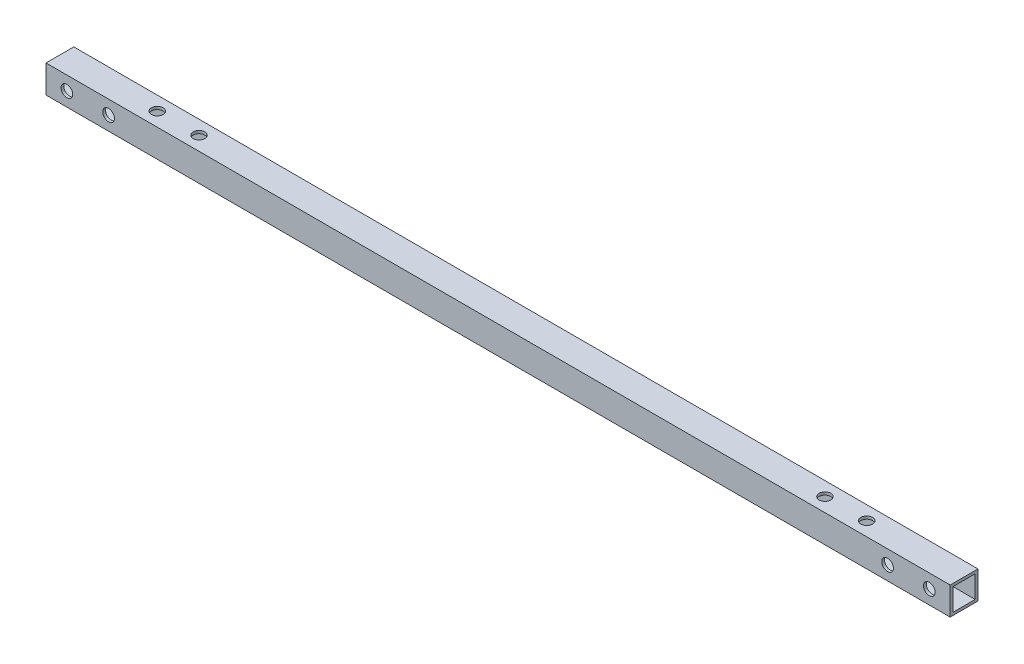
ISO-10303-21;
HEADER;
FILE_DESCRIPTION(('STEP AP214'),'2;1');
FILE_NAME('part.step','',(''),(''),'','','');
FILE_SCHEMA(('AUTOMOTIVE_DESIGN { 1 0 10303 214 1 1 1 1 }'));
ENDSEC;
DATA;
#1=APPLICATION_CONTEXT('core data for automotive mechanical design processes');
#2=APPLICATION_PROTOCOL_DEFINITION('international standard','automotive_design',2000,#1);
#3=PRODUCT_CONTEXT('',#1,'mechanical');
#4=PRODUCT('Part','Part','',(#3));
#5=PRODUCT_RELATED_PRODUCT_CATEGORY('part','',(#4));
#6=PRODUCT_DEFINITION_FORMATION('','',#4);
#7=PRODUCT_DEFINITION_CONTEXT('part definition',#1,'design');
#8=PRODUCT_DEFINITION('design','',#6,#7);
#9=PRODUCT_DEFINITION_SHAPE('','',#8);
#10=(LENGTH_UNIT() NAMED_UNIT(*) SI_UNIT(.MILLI.,.METRE.));
#11=(NAMED_UNIT(*) PLANE_ANGLE_UNIT() SI_UNIT($,.RADIAN.));
#12=(NAMED_UNIT(*) SI_UNIT($,.STERADIAN.) SOLID_ANGLE_UNIT());
#13=UNCERTAINTY_MEASURE_WITH_UNIT(LENGTH_MEASURE(1.E-05),#10,'distance_accuracy_value','');
#14=(GEOMETRIC_REPRESENTATION_CONTEXT(3) GLOBAL_UNCERTAINTY_ASSIGNED_CONTEXT((#13)) GLOBAL_UNIT_ASSIGNED_CONTEXT((#10,
#11,#12)) REPRESENTATION_CONTEXT('',''));
#15=CARTESIAN_POINT('',(0.,0.,0.));
#16=DIRECTION('',(0.,0.,1.));
#17=DIRECTION('',(1.,0.,0.));
#18=AXIS2_PLACEMENT_3D('',#15,#16,#17);
#19=CARTESIAN_POINT('',(325.,0.,0.));
#20=DIRECTION('',(1.,0.,0.));
#21=DIRECTION('',(0.,0.,-1.));
#22=AXIS2_PLACEMENT_3D('',#19,#20,#21);
#23=PLANE('',#22);
#24=DIRECTION('',(0.,1.,0.));
#25=VECTOR('',#24,1.);
#26=CARTESIAN_POINT('',(325.,5.,-5.));
#27=LINE('',#26,#25);
#28=CARTESIAN_POINT('',(325.,-5.,-5.));
#29=VERTEX_POINT('',#28);
#30=CARTESIAN_POINT('',(325.,5.,-5.));
#31=VERTEX_POINT('',#30);
#32=EDGE_CURVE('E164',#29,#31,#27,.T.);
#33=ORIENTED_EDGE('',*,*,#32,.T.);
#34=DIRECTION('',(0.,0.,1.));
#35=VECTOR('',#34,1.);
#36=CARTESIAN_POINT('',(325.,5.,5.));
#37=LINE('',#36,#35);
#38=CARTESIAN_POINT('',(325.,5.,5.));
#39=VERTEX_POINT('',#38);
#40=EDGE_CURVE('E167',#31,#39,#37,.T.);
#41=ORIENTED_EDGE('',*,*,#40,.T.);
#42=DIRECTION('',(0.,-1.,0.));
#43=VECTOR('',#42,1.);
#44=CARTESIAN_POINT('',(325.,5.,5.));
#45=LINE('',#44,#43);
#46=CARTESIAN_POINT('',(325.,-5.,5.));
#47=VERTEX_POINT('',#46);
#48=EDGE_CURVE('E170',#39,#47,#45,.T.);
#49=ORIENTED_EDGE('',*,*,#48,.T.);
#50=DIRECTION('',(0.,0.,-1.));
#51=VECTOR('',#50,1.);
#52=CARTESIAN_POINT('',(325.,-5.,5.));
#53=LINE('',#52,#51);
#54=EDGE_CURVE('E172',#47,#29,#53,.T.);
#55=ORIENTED_EDGE('',*,*,#54,.T.);
#56=EDGE_LOOP('',(#33,#41,#49,#55));
#57=FACE_BOUND('',#56,.T.);
#58=DIRECTION('',(0.,0.,1.));
#59=VECTOR('',#58,1.);
#60=CARTESIAN_POINT('',(325.,4.,5.));
#61=LINE('',#60,#59);
#62=CARTESIAN_POINT('',(325.,4.,-4.));
#63=VERTEX_POINT('',#62);
#64=CARTESIAN_POINT('',(325.,4.,4.));
#65=VERTEX_POINT('',#64);
#66=EDGE_CURVE('E134',#63,#65,#61,.T.);
#67=ORIENTED_EDGE('',*,*,#66,.F.);
#68=DIRECTION('',(0.,1.,0.));
#69=VECTOR('',#68,1.);
#70=CARTESIAN_POINT('',(325.,5.,-4.));
#71=LINE('',#70,#69);
#72=CARTESIAN_POINT('',(325.,-4.,-4.));
#73=VERTEX_POINT('',#72);
#74=EDGE_CURVE('E126',#73,#63,#71,.T.);
#75=ORIENTED_EDGE('',*,*,#74,.F.);
#76=DIRECTION('',(0.,0.,-1.));
#77=VECTOR('',#76,1.);
#78=CARTESIAN_POINT('',(325.,-4.,5.));
#79=LINE('',#78,#77);
#80=CARTESIAN_POINT('',(325.,-4.,4.));
#81=VERTEX_POINT('',#80);
#82=EDGE_CURVE('E148',#81,#73,#79,.T.);
#83=ORIENTED_EDGE('',*,*,#82,.F.);
#84=DIRECTION('',(0.,-1.,0.));
#85=VECTOR('',#84,1.);
#86=CARTESIAN_POINT('',(325.,5.,4.));
#87=LINE('',#86,#85);
#88=EDGE_CURVE('E146',#65,#81,#87,.T.);
#89=ORIENTED_EDGE('',*,*,#88,.F.);
#90=EDGE_LOOP('',(#67,#75,#83,#89));
#91=FACE_BOUND('',#90,.T.);
#92=ADVANCED_FACE('F59',(#57,#91),#23,.T.);
#93=CARTESIAN_POINT('',(0.,0.,0.));
#94=DIRECTION('',(1.,0.,0.));
#95=DIRECTION('',(0.,0.,-1.));
#96=AXIS2_PLACEMENT_3D('',#93,#94,#95);
#97=PLANE('',#96);
#98=DIRECTION('',(0.,1.,0.));
#99=VECTOR('',#98,1.);
#100=CARTESIAN_POINT('',(0.,5.,-5.));
#101=LINE('',#100,#99);
#102=CARTESIAN_POINT('',(0.,-5.,-5.));
#103=VERTEX_POINT('',#102);
#104=CARTESIAN_POINT('',(0.,5.,-5.));
#105=VERTEX_POINT('',#104);
#106=EDGE_CURVE('E142',#103,#105,#101,.T.);
#107=ORIENTED_EDGE('',*,*,#106,.F.);
#108=DIRECTION('',(0.,0.,-1.));
#109=VECTOR('',#108,1.);
#110=CARTESIAN_POINT('',(0.,-5.,5.));
#111=LINE('',#110,#109);
#112=CARTESIAN_POINT('',(0.,-5.,5.));
#113=VERTEX_POINT('',#112);
#114=EDGE_CURVE('E168',#113,#103,#111,.T.);
#115=ORIENTED_EDGE('',*,*,#114,.F.);
#116=DIRECTION('',(0.,-1.,0.));
#117=VECTOR('',#116,1.);
#118=CARTESIAN_POINT('',(0.,5.,5.));
#119=LINE('',#118,#117);
#120=CARTESIAN_POINT('',(0.,5.,5.));
#121=VERTEX_POINT('',#120);
#122=EDGE_CURVE('E179',#121,#113,#119,.T.);
#123=ORIENTED_EDGE('',*,*,#122,.F.);
#124=DIRECTION('',(0.,0.,1.));
#125=VECTOR('',#124,1.);
#126=CARTESIAN_POINT('',(0.,5.,5.));
#127=LINE('',#126,#125);
#128=EDGE_CURVE('E177',#105,#121,#127,.T.);
#129=ORIENTED_EDGE('',*,*,#128,.F.);
#130=EDGE_LOOP('',(#107,#115,#123,#129));
#131=FACE_BOUND('',#130,.T.);
#132=DIRECTION('',(0.,1.,0.));
#133=VECTOR('',#132,1.);
#134=CARTESIAN_POINT('',(0.,5.,-4.));
#135=LINE('',#134,#133);
#136=CARTESIAN_POINT('',(0.,-4.,-4.));
#137=VERTEX_POINT('',#136);
#138=CARTESIAN_POINT('',(0.,4.,-4.));
#139=VERTEX_POINT('',#138);
#140=EDGE_CURVE('E84',#137,#139,#135,.T.);
#141=ORIENTED_EDGE('',*,*,#140,.T.);
#142=DIRECTION('',(0.,0.,1.));
#143=VECTOR('',#142,1.);
#144=CARTESIAN_POINT('',(0.,4.,5.));
#145=LINE('',#144,#143);
#146=CARTESIAN_POINT('',(0.,4.,4.));
#147=VERTEX_POINT('',#146);
#148=EDGE_CURVE('E141',#139,#147,#145,.T.);
#149=ORIENTED_EDGE('',*,*,#148,.T.);
#150=DIRECTION('',(0.,-1.,0.));
#151=VECTOR('',#150,1.);
#152=CARTESIAN_POINT('',(0.,5.,4.));
#153=LINE('',#152,#151);
#154=CARTESIAN_POINT('',(0.,-4.,4.));
#155=VERTEX_POINT('',#154);
#156=EDGE_CURVE('E156',#147,#155,#153,.T.);
#157=ORIENTED_EDGE('',*,*,#156,.T.);
#158=DIRECTION('',(0.,0.,-1.));
#159=VECTOR('',#158,1.);
#160=CARTESIAN_POINT('',(0.,-4.,5.));
#161=LINE('',#160,#159);
#162=EDGE_CURVE('E135',#155,#137,#161,.T.);
#163=ORIENTED_EDGE('',*,*,#162,.T.);
#164=EDGE_LOOP('',(#141,#149,#157,#163));
#165=FACE_BOUND('',#164,.T.);
#166=ADVANCED_FACE('F286',(#131,#165),#97,.F.);
#167=CARTESIAN_POINT('',(325.,5.,-5.));
#168=DIRECTION('',(0.,0.,1.));
#169=DIRECTION('',(0.,-1.,0.));
#170=AXIS2_PLACEMENT_3D('',#167,#168,#169);
#171=PLANE('',#170);
#172=CARTESIAN_POINT('',(7.5,0.,-5.));
#173=DIRECTION('',(0.,0.,1.));
#174=DIRECTION('',(1.,0.,0.));
#175=AXIS2_PLACEMENT_3D('',#172,#173,#174);
#176=CIRCLE('',#175,2.1);
#177=CARTESIAN_POINT('',(9.6,0.,-5.));
#178=VERTEX_POINT('',#177);
#179=EDGE_CURVE('E237',#178,#178,#176,.T.);
#180=ORIENTED_EDGE('',*,*,#179,.T.);
#181=EDGE_LOOP('',(#180));
#182=FACE_BOUND('',#181,.T.);
#183=CARTESIAN_POINT('',(317.5,0.,-5.));
#184=DIRECTION('',(0.,0.,1.));
#185=DIRECTION('',(-1.,0.,0.));
#186=AXIS2_PLACEMENT_3D('',#183,#184,#185);
#187=CIRCLE('',#186,2.09999999999999);
#188=CARTESIAN_POINT('',(315.4,0.,-5.));
#189=VERTEX_POINT('',#188);
#190=EDGE_CURVE('E244',#189,#189,#187,.T.);
#191=ORIENTED_EDGE('',*,*,#190,.T.);
#192=EDGE_LOOP('',(#191));
#193=FACE_BOUND('',#192,.T.);
#194=CARTESIAN_POINT('',(302.5,0.,-5.));
#195=DIRECTION('',(0.,0.,1.));
#196=DIRECTION('',(-1.,0.,0.));
#197=AXIS2_PLACEMENT_3D('',#194,#195,#196);
#198=CIRCLE('',#197,2.09999999999999);
#199=CARTESIAN_POINT('',(300.4,0.,-5.));
#200=VERTEX_POINT('',#199);
#201=EDGE_CURVE('E231',#200,#200,#198,.T.);
#202=ORIENTED_EDGE('',*,*,#201,.T.);
#203=EDGE_LOOP('',(#202));
#204=FACE_BOUND('',#203,.T.);
#205=CARTESIAN_POINT('',(22.5,0.,-5.));
#206=DIRECTION('',(0.,0.,1.));
#207=DIRECTION('',(1.,0.,0.));
#208=AXIS2_PLACEMENT_3D('',#205,#206,#207);
#209=CIRCLE('',#208,2.1);
#210=CARTESIAN_POINT('',(24.6,0.,-5.));
#211=VERTEX_POINT('',#210);
#212=EDGE_CURVE('E193',#211,#211,#209,.T.);
#213=ORIENTED_EDGE('',*,*,#212,.T.);
#214=EDGE_LOOP('',(#213));
#215=FACE_BOUND('',#214,.T.);
#216=ORIENTED_EDGE('',*,*,#106,.T.);
#217=DIRECTION('',(-1.,0.,0.));
#218=VECTOR('',#217,1.);
#219=CARTESIAN_POINT('',(325.,5.,-5.));
#220=LINE('',#219,#218);
#221=EDGE_CURVE('E12',#31,#105,#220,.T.);
#222=ORIENTED_EDGE('',*,*,#221,.F.);
#223=ORIENTED_EDGE('',*,*,#32,.F.);
#224=DIRECTION('',(-1.,0.,0.));
#225=VECTOR('',#224,1.);
#226=CARTESIAN_POINT('',(325.,-5.,-5.));
#227=LINE('',#226,#225);
#228=EDGE_CURVE('E174',#29,#103,#227,.T.);
#229=ORIENTED_EDGE('',*,*,#228,.T.);
#230=EDGE_LOOP('',(#216,#222,#223,#229));
#231=FACE_BOUND('',#230,.T.);
#232=ADVANCED_FACE('F61',(#182,#193,#204,#215,#231),#171,.F.);
#233=CARTESIAN_POINT('',(325.,5.,5.));
#234=DIRECTION('',(0.,-1.,0.));
#235=DIRECTION('',(0.,0.,-1.));
#236=AXIS2_PLACEMENT_3D('',#233,#234,#235);
#237=PLANE('',#236);
#238=CARTESIAN_POINT('',(290.,5.,0.));
#239=DIRECTION('',(0.,1.,0.));
#240=DIRECTION('',(0.,0.,1.));
#241=AXIS2_PLACEMENT_3D('',#238,#239,#240);
#242=CIRCLE('',#241,2.09999999999999);
#243=CARTESIAN_POINT('',(290.,5.,2.09999999999999));
#244=VERTEX_POINT('',#243);
#245=EDGE_CURVE('E392',#244,#244,#242,.T.);
#246=ORIENTED_EDGE('',*,*,#245,.F.);
#247=EDGE_LOOP('',(#246));
#248=FACE_BOUND('',#247,.T.);
#249=CARTESIAN_POINT('',(35.,5.,0.));
#250=DIRECTION('',(0.,1.,0.));
#251=DIRECTION('',(0.,0.,-1.));
#252=AXIS2_PLACEMENT_3D('',#249,#250,#251);
#253=CIRCLE('',#252,2.09999999999999);
#254=CARTESIAN_POINT('',(35.,5.,-2.09999999999995));
#255=VERTEX_POINT('',#254);
#256=EDGE_CURVE('E385',#255,#255,#253,.T.);
#257=ORIENTED_EDGE('',*,*,#256,.F.);
#258=EDGE_LOOP('',(#257));
#259=FACE_BOUND('',#258,.T.);
#260=CARTESIAN_POINT('',(50.,5.,0.));
#261=DIRECTION('',(0.,1.,0.));
#262=DIRECTION('',(0.,0.,-1.));
#263=AXIS2_PLACEMENT_3D('',#260,#261,#262);
#264=CIRCLE('',#263,2.09999999999999);
#265=CARTESIAN_POINT('',(50.,5.,-2.09999999999996));
#266=VERTEX_POINT('',#265);
#267=EDGE_CURVE('E380',#266,#266,#264,.T.);
#268=ORIENTED_EDGE('',*,*,#267,.F.);
#269=EDGE_LOOP('',(#268));
#270=FACE_BOUND('',#269,.T.);
#271=CARTESIAN_POINT('',(275.,5.,0.));
#272=DIRECTION('',(0.,1.,0.));
#273=DIRECTION('',(0.,0.,1.));
#274=AXIS2_PLACEMENT_3D('',#271,#272,#273);
#275=CIRCLE('',#274,2.09999999999999);
#276=CARTESIAN_POINT('',(275.,5.,2.1));
#277=VERTEX_POINT('',#276);
#278=EDGE_CURVE('E391',#277,#277,#275,.T.);
#279=ORIENTED_EDGE('',*,*,#278,.F.);
#280=EDGE_LOOP('',(#279));
#281=FACE_BOUND('',#280,.T.);
#282=ORIENTED_EDGE('',*,*,#128,.T.);
#283=DIRECTION('',(-1.,0.,0.));
#284=VECTOR('',#283,1.);
#285=CARTESIAN_POINT('',(325.,5.,5.));
#286=LINE('',#285,#284);
#287=EDGE_CURVE('E68',#39,#121,#286,.T.);
#288=ORIENTED_EDGE('',*,*,#287,.F.);
#289=ORIENTED_EDGE('',*,*,#40,.F.);
#290=ORIENTED_EDGE('',*,*,#221,.T.);
#291=EDGE_LOOP('',(#282,#288,#289,#290));
#292=FACE_BOUND('',#291,.T.);
#293=ADVANCED_FACE('F285',(#248,#259,#270,#281,#292),#237,.F.);
#294=CARTESIAN_POINT('',(325.,5.,5.));
#295=DIRECTION('',(0.,0.,-1.));
#296=DIRECTION('',(0.,1.,0.));
#297=AXIS2_PLACEMENT_3D('',#294,#295,#296);
#298=PLANE('',#297);
#299=CARTESIAN_POINT('',(7.5,0.,5.));
#300=DIRECTION('',(0.,0.,1.));
#301=DIRECTION('',(1.,0.,0.));
#302=AXIS2_PLACEMENT_3D('',#299,#300,#301);
#303=CIRCLE('',#302,2.1);
#304=CARTESIAN_POINT('',(9.6,0.,5.));
#305=VERTEX_POINT('',#304);
#306=EDGE_CURVE('E241',#305,#305,#303,.T.);
#307=ORIENTED_EDGE('',*,*,#306,.F.);
#308=EDGE_LOOP('',(#307));
#309=FACE_BOUND('',#308,.T.);
#310=CARTESIAN_POINT('',(317.5,0.,5.));
#311=DIRECTION('',(0.,0.,1.));
#312=DIRECTION('',(-1.,0.,0.));
#313=AXIS2_PLACEMENT_3D('',#310,#311,#312);
#314=CIRCLE('',#313,2.09999999999999);
#315=CARTESIAN_POINT('',(315.4,0.,5.));
#316=VERTEX_POINT('',#315);
#317=EDGE_CURVE('E234',#316,#316,#314,.T.);
#318=ORIENTED_EDGE('',*,*,#317,.F.);
#319=EDGE_LOOP('',(#318));
#320=FACE_BOUND('',#319,.T.);
#321=CARTESIAN_POINT('',(302.5,0.,5.));
#322=DIRECTION('',(0.,0.,1.));
#323=DIRECTION('',(-1.,0.,0.));
#324=AXIS2_PLACEMENT_3D('',#321,#322,#323);
#325=CIRCLE('',#324,2.09999999999999);
#326=CARTESIAN_POINT('',(300.4,0.,5.));
#327=VERTEX_POINT('',#326);
#328=EDGE_CURVE('E230',#327,#327,#325,.T.);
#329=ORIENTED_EDGE('',*,*,#328,.F.);
#330=EDGE_LOOP('',(#329));
#331=FACE_BOUND('',#330,.T.);
#332=CARTESIAN_POINT('',(22.5,0.,5.));
#333=DIRECTION('',(0.,0.,1.));
#334=DIRECTION('',(1.,0.,0.));
#335=AXIS2_PLACEMENT_3D('',#332,#333,#334);
#336=CIRCLE('',#335,2.1);
#337=CARTESIAN_POINT('',(24.6,0.,5.));
#338=VERTEX_POINT('',#337);
#339=EDGE_CURVE('E240',#338,#338,#336,.T.);
#340=ORIENTED_EDGE('',*,*,#339,.F.);
#341=EDGE_LOOP('',(#340));
#342=FACE_BOUND('',#341,.T.);
#343=ORIENTED_EDGE('',*,*,#122,.T.);
#344=DIRECTION('',(-1.,0.,0.));
#345=VECTOR('',#344,1.);
#346=CARTESIAN_POINT('',(325.,-5.,5.));
#347=LINE('',#346,#345);
#348=EDGE_CURVE('E184',#47,#113,#347,.T.);
#349=ORIENTED_EDGE('',*,*,#348,.F.);
#350=ORIENTED_EDGE('',*,*,#48,.F.);
#351=ORIENTED_EDGE('',*,*,#287,.T.);
#352=EDGE_LOOP('',(#343,#349,#350,#351));
#353=FACE_BOUND('',#352,.T.);
#354=ADVANCED_FACE('F304',(#309,#320,#331,#342,#353),#298,.F.);
#355=CARTESIAN_POINT('',(325.,-5.,5.));
#356=DIRECTION('',(0.,1.,0.));
#357=DIRECTION('',(0.,0.,1.));
#358=AXIS2_PLACEMENT_3D('',#355,#356,#357);
#359=PLANE('',#358);
#360=CARTESIAN_POINT('',(290.,-5.,0.));
#361=DIRECTION('',(0.,1.,0.));
#362=DIRECTION('',(0.,0.,1.));
#363=AXIS2_PLACEMENT_3D('',#360,#361,#362);
#364=CIRCLE('',#363,2.09999999999999);
#365=CARTESIAN_POINT('',(290.,-5.,2.09999999999999));
#366=VERTEX_POINT('',#365);
#367=EDGE_CURVE('E388',#366,#366,#364,.T.);
#368=ORIENTED_EDGE('',*,*,#367,.T.);
#369=EDGE_LOOP('',(#368));
#370=FACE_BOUND('',#369,.T.);
#371=CARTESIAN_POINT('',(35.,-5.,0.));
#372=DIRECTION('',(0.,1.,0.));
#373=DIRECTION('',(0.,0.,-1.));
#374=AXIS2_PLACEMENT_3D('',#371,#372,#373);
#375=CIRCLE('',#374,2.09999999999999);
#376=CARTESIAN_POINT('',(35.,-5.,-2.09999999999995));
#377=VERTEX_POINT('',#376);
#378=EDGE_CURVE('E395',#377,#377,#375,.T.);
#379=ORIENTED_EDGE('',*,*,#378,.T.);
#380=EDGE_LOOP('',(#379));
#381=FACE_BOUND('',#380,.T.);
#382=CARTESIAN_POINT('',(50.,-5.,0.));
#383=DIRECTION('',(0.,1.,0.));
#384=DIRECTION('',(0.,0.,-1.));
#385=AXIS2_PLACEMENT_3D('',#382,#383,#384);
#386=CIRCLE('',#385,2.09999999999999);
#387=CARTESIAN_POINT('',(50.,-5.,-2.09999999999996));
#388=VERTEX_POINT('',#387);
#389=EDGE_CURVE('E382',#388,#388,#386,.T.);
#390=ORIENTED_EDGE('',*,*,#389,.T.);
#391=EDGE_LOOP('',(#390));
#392=FACE_BOUND('',#391,.T.);
#393=CARTESIAN_POINT('',(275.,-5.,0.));
#394=DIRECTION('',(0.,1.,0.));
#395=DIRECTION('',(0.,0.,1.));
#396=AXIS2_PLACEMENT_3D('',#393,#394,#395);
#397=CIRCLE('',#396,2.09999999999999);
#398=CARTESIAN_POINT('',(275.,-5.,2.1));
#399=VERTEX_POINT('',#398);
#400=EDGE_CURVE('E209',#399,#399,#397,.T.);
#401=ORIENTED_EDGE('',*,*,#400,.T.);
#402=EDGE_LOOP('',(#401));
#403=FACE_BOUND('',#402,.T.);
#404=ORIENTED_EDGE('',*,*,#114,.T.);
#405=ORIENTED_EDGE('',*,*,#228,.F.);
#406=ORIENTED_EDGE('',*,*,#54,.F.);
#407=ORIENTED_EDGE('',*,*,#348,.T.);
#408=EDGE_LOOP('',(#404,#405,#406,#407));
#409=FACE_BOUND('',#408,.T.);
#410=ADVANCED_FACE('F266',(#370,#381,#392,#403,#409),#359,.F.);
#411=CARTESIAN_POINT('',(325.,5.,-4.));
#412=DIRECTION('',(0.,0.,1.));
#413=DIRECTION('',(0.,-1.,0.));
#414=AXIS2_PLACEMENT_3D('',#411,#412,#413);
#415=PLANE('',#414);
#416=CARTESIAN_POINT('',(7.5,0.,-4.));
#417=DIRECTION('',(0.,0.,1.));
#418=DIRECTION('',(0.,-1.,0.));
#419=AXIS2_PLACEMENT_3D('',#416,#417,#418);
#420=CIRCLE('',#419,2.1);
#421=CARTESIAN_POINT('',(7.5,-2.1,-4.));
#422=VERTEX_POINT('',#421);
#423=EDGE_CURVE('E154',#422,#422,#420,.T.);
#424=ORIENTED_EDGE('',*,*,#423,.F.);
#425=EDGE_LOOP('',(#424));
#426=FACE_BOUND('',#425,.T.);
#427=CARTESIAN_POINT('',(317.5,0.,-4.));
#428=DIRECTION('',(0.,0.,1.));
#429=DIRECTION('',(0.,-1.,0.));
#430=AXIS2_PLACEMENT_3D('',#427,#428,#429);
#431=CIRCLE('',#430,2.09999999999999);
#432=CARTESIAN_POINT('',(317.5,-2.09999999999995,-4.));
#433=VERTEX_POINT('',#432);
#434=EDGE_CURVE('E201',#433,#433,#431,.T.);
#435=ORIENTED_EDGE('',*,*,#434,.F.);
#436=EDGE_LOOP('',(#435));
#437=FACE_BOUND('',#436,.T.);
#438=CARTESIAN_POINT('',(302.5,0.,-4.));
#439=DIRECTION('',(0.,0.,1.));
#440=DIRECTION('',(0.,-1.,0.));
#441=AXIS2_PLACEMENT_3D('',#438,#439,#440);
#442=CIRCLE('',#441,2.09999999999999);
#443=CARTESIAN_POINT('',(302.5,-2.09999999999996,-4.));
#444=VERTEX_POINT('',#443);
#445=EDGE_CURVE('E197',#444,#444,#442,.T.);
#446=ORIENTED_EDGE('',*,*,#445,.F.);
#447=EDGE_LOOP('',(#446));
#448=FACE_BOUND('',#447,.T.);
#449=CARTESIAN_POINT('',(22.5,0.,-4.));
#450=DIRECTION('',(0.,0.,1.));
#451=DIRECTION('',(0.,-1.,0.));
#452=AXIS2_PLACEMENT_3D('',#449,#450,#451);
#453=CIRCLE('',#452,2.1);
#454=CARTESIAN_POINT('',(22.5,-2.1,-4.));
#455=VERTEX_POINT('',#454);
#456=EDGE_CURVE('E192',#455,#455,#453,.T.);
#457=ORIENTED_EDGE('',*,*,#456,.F.);
#458=EDGE_LOOP('',(#457));
#459=FACE_BOUND('',#458,.T.);
#460=ORIENTED_EDGE('',*,*,#140,.F.);
#461=DIRECTION('',(-1.,0.,0.));
#462=VECTOR('',#461,1.);
#463=CARTESIAN_POINT('',(325.,-4.,-4.));
#464=LINE('',#463,#462);
#465=EDGE_CURVE('E130',#73,#137,#464,.T.);
#466=ORIENTED_EDGE('',*,*,#465,.F.);
#467=ORIENTED_EDGE('',*,*,#74,.T.);
#468=DIRECTION('',(-1.,0.,0.));
#469=VECTOR('',#468,1.);
#470=CARTESIAN_POINT('',(325.,4.,-4.));
#471=LINE('',#470,#469);
#472=EDGE_CURVE('E129',#63,#139,#471,.T.);
#473=ORIENTED_EDGE('',*,*,#472,.T.);
#474=EDGE_LOOP('',(#460,#466,#467,#473));
#475=FACE_BOUND('',#474,.T.);
#476=ADVANCED_FACE('F128',(#426,#437,#448,#459,#475),#415,.T.);
#477=CARTESIAN_POINT('',(325.,4.,5.));
#478=DIRECTION('',(0.,-1.,0.));
#479=DIRECTION('',(0.,0.,-1.));
#480=AXIS2_PLACEMENT_3D('',#477,#478,#479);
#481=PLANE('',#480);
#482=CARTESIAN_POINT('',(290.,4.,0.));
#483=DIRECTION('',(0.,-1.,0.));
#484=DIRECTION('',(0.,0.,-1.));
#485=AXIS2_PLACEMENT_3D('',#482,#483,#484);
#486=CIRCLE('',#485,2.09999999999999);
#487=CARTESIAN_POINT('',(290.,4.,-2.09999999999999));
#488=VERTEX_POINT('',#487);
#489=EDGE_CURVE('E227',#488,#488,#486,.T.);
#490=ORIENTED_EDGE('',*,*,#489,.F.);
#491=EDGE_LOOP('',(#490));
#492=FACE_BOUND('',#491,.T.);
#493=CARTESIAN_POINT('',(35.,4.,0.));
#494=DIRECTION('',(0.,-1.,0.));
#495=DIRECTION('',(0.,0.,-1.));
#496=AXIS2_PLACEMENT_3D('',#493,#494,#495);
#497=CIRCLE('',#496,2.09999999999999);
#498=CARTESIAN_POINT('',(35.,4.,-2.09999999999995));
#499=VERTEX_POINT('',#498);
#500=EDGE_CURVE('E215',#499,#499,#497,.T.);
#501=ORIENTED_EDGE('',*,*,#500,.F.);
#502=EDGE_LOOP('',(#501));
#503=FACE_BOUND('',#502,.T.);
#504=CARTESIAN_POINT('',(50.,4.,0.));
#505=DIRECTION('',(0.,-1.,0.));
#506=DIRECTION('',(0.,0.,-1.));
#507=AXIS2_PLACEMENT_3D('',#504,#505,#506);
#508=CIRCLE('',#507,2.09999999999999);
#509=CARTESIAN_POINT('',(50.,4.,-2.09999999999996));
#510=VERTEX_POINT('',#509);
#511=EDGE_CURVE('E212',#510,#510,#508,.T.);
#512=ORIENTED_EDGE('',*,*,#511,.F.);
#513=EDGE_LOOP('',(#512));
#514=FACE_BOUND('',#513,.T.);
#515=CARTESIAN_POINT('',(275.,4.,0.));
#516=DIRECTION('',(0.,-1.,0.));
#517=DIRECTION('',(0.,0.,-1.));
#518=AXIS2_PLACEMENT_3D('',#515,#516,#517);
#519=CIRCLE('',#518,2.09999999999999);
#520=CARTESIAN_POINT('',(275.,4.,-2.09999999999998));
#521=VERTEX_POINT('',#520);
#522=EDGE_CURVE('E208',#521,#521,#519,.T.);
#523=ORIENTED_EDGE('',*,*,#522,.F.);
#524=EDGE_LOOP('',(#523));
#525=FACE_BOUND('',#524,.T.);
#526=ORIENTED_EDGE('',*,*,#148,.F.);
#527=ORIENTED_EDGE('',*,*,#472,.F.);
#528=ORIENTED_EDGE('',*,*,#66,.T.);
#529=DIRECTION('',(-1.,0.,0.));
#530=VECTOR('',#529,1.);
#531=CARTESIAN_POINT('',(325.,4.,4.));
#532=LINE('',#531,#530);
#533=EDGE_CURVE('E143',#65,#147,#532,.T.);
#534=ORIENTED_EDGE('',*,*,#533,.T.);
#535=EDGE_LOOP('',(#526,#527,#528,#534));
#536=FACE_BOUND('',#535,.T.);
#537=ADVANCED_FACE('F138',(#492,#503,#514,#525,#536),#481,.T.);
#538=CARTESIAN_POINT('',(325.,5.,4.));
#539=DIRECTION('',(0.,0.,-1.));
#540=DIRECTION('',(0.,1.,0.));
#541=AXIS2_PLACEMENT_3D('',#538,#539,#540);
#542=PLANE('',#541);
#543=CARTESIAN_POINT('',(7.5,0.,4.));
#544=DIRECTION('',(0.,0.,-1.));
#545=DIRECTION('',(0.,1.,0.));
#546=AXIS2_PLACEMENT_3D('',#543,#544,#545);
#547=CIRCLE('',#546,2.1);
#548=CARTESIAN_POINT('',(7.5,2.1,4.));
#549=VERTEX_POINT('',#548);
#550=EDGE_CURVE('E202',#549,#549,#547,.T.);
#551=ORIENTED_EDGE('',*,*,#550,.F.);
#552=EDGE_LOOP('',(#551));
#553=FACE_BOUND('',#552,.T.);
#554=CARTESIAN_POINT('',(317.5,0.,4.));
#555=DIRECTION('',(0.,0.,-1.));
#556=DIRECTION('',(0.,1.,0.));
#557=AXIS2_PLACEMENT_3D('',#554,#555,#556);
#558=CIRCLE('',#557,2.09999999999999);
#559=CARTESIAN_POINT('',(317.5,2.10000000000003,4.));
#560=VERTEX_POINT('',#559);
#561=EDGE_CURVE('E198',#560,#560,#558,.T.);
#562=ORIENTED_EDGE('',*,*,#561,.F.);
#563=EDGE_LOOP('',(#562));
#564=FACE_BOUND('',#563,.T.);
#565=CARTESIAN_POINT('',(302.5,0.,4.));
#566=DIRECTION('',(0.,0.,-1.));
#567=DIRECTION('',(0.,1.,0.));
#568=AXIS2_PLACEMENT_3D('',#565,#566,#567);
#569=CIRCLE('',#568,2.09999999999999);
#570=CARTESIAN_POINT('',(302.5,2.10000000000002,4.));
#571=VERTEX_POINT('',#570);
#572=EDGE_CURVE('E194',#571,#571,#569,.T.);
#573=ORIENTED_EDGE('',*,*,#572,.F.);
#574=EDGE_LOOP('',(#573));
#575=FACE_BOUND('',#574,.T.);
#576=CARTESIAN_POINT('',(22.5,0.,4.));
#577=DIRECTION('',(0.,0.,-1.));
#578=DIRECTION('',(0.,1.,0.));
#579=AXIS2_PLACEMENT_3D('',#576,#577,#578);
#580=CIRCLE('',#579,2.1);
#581=CARTESIAN_POINT('',(22.5,2.1,4.));
#582=VERTEX_POINT('',#581);
#583=EDGE_CURVE('E189',#582,#582,#580,.T.);
#584=ORIENTED_EDGE('',*,*,#583,.F.);
#585=EDGE_LOOP('',(#584));
#586=FACE_BOUND('',#585,.T.);
#587=ORIENTED_EDGE('',*,*,#156,.F.);
#588=ORIENTED_EDGE('',*,*,#533,.F.);
#589=ORIENTED_EDGE('',*,*,#88,.T.);
#590=DIRECTION('',(-1.,0.,0.));
#591=VECTOR('',#590,1.);
#592=CARTESIAN_POINT('',(325.,-4.,4.));
#593=LINE('',#592,#591);
#594=EDGE_CURVE('E76',#81,#155,#593,.T.);
#595=ORIENTED_EDGE('',*,*,#594,.T.);
#596=EDGE_LOOP('',(#587,#588,#589,#595));
#597=FACE_BOUND('',#596,.T.);
#598=ADVANCED_FACE('F326',(#553,#564,#575,#586,#597),#542,.T.);
#599=CARTESIAN_POINT('',(325.,-4.,5.));
#600=DIRECTION('',(0.,1.,0.));
#601=DIRECTION('',(0.,0.,1.));
#602=AXIS2_PLACEMENT_3D('',#599,#600,#601);
#603=PLANE('',#602);
#604=CARTESIAN_POINT('',(290.,-4.,0.));
#605=DIRECTION('',(0.,1.,0.));
#606=DIRECTION('',(0.,0.,1.));
#607=AXIS2_PLACEMENT_3D('',#604,#605,#606);
#608=CIRCLE('',#607,2.09999999999999);
#609=CARTESIAN_POINT('',(290.,-4.,2.09999999999999));
#610=VERTEX_POINT('',#609);
#611=EDGE_CURVE('E63',#610,#610,#608,.T.);
#612=ORIENTED_EDGE('',*,*,#611,.F.);
#613=EDGE_LOOP('',(#612));
#614=FACE_BOUND('',#613,.T.);
#615=CARTESIAN_POINT('',(35.,-4.,0.));
#616=DIRECTION('',(0.,1.,0.));
#617=DIRECTION('',(0.,0.,1.));
#618=AXIS2_PLACEMENT_3D('',#615,#616,#617);
#619=CIRCLE('',#618,2.09999999999999);
#620=CARTESIAN_POINT('',(35.,-4.,2.10000000000003));
#621=VERTEX_POINT('',#620);
#622=EDGE_CURVE('E213',#621,#621,#619,.T.);
#623=ORIENTED_EDGE('',*,*,#622,.F.);
#624=EDGE_LOOP('',(#623));
#625=FACE_BOUND('',#624,.T.);
#626=CARTESIAN_POINT('',(50.,-4.,0.));
#627=DIRECTION('',(0.,1.,0.));
#628=DIRECTION('',(0.,0.,1.));
#629=AXIS2_PLACEMENT_3D('',#626,#627,#628);
#630=CIRCLE('',#629,2.09999999999999);
#631=CARTESIAN_POINT('',(50.,-4.,2.10000000000002));
#632=VERTEX_POINT('',#631);
#633=EDGE_CURVE('E210',#632,#632,#630,.T.);
#634=ORIENTED_EDGE('',*,*,#633,.F.);
#635=EDGE_LOOP('',(#634));
#636=FACE_BOUND('',#635,.T.);
#637=CARTESIAN_POINT('',(275.,-4.,0.));
#638=DIRECTION('',(0.,1.,0.));
#639=DIRECTION('',(0.,0.,1.));
#640=AXIS2_PLACEMENT_3D('',#637,#638,#639);
#641=CIRCLE('',#640,2.09999999999999);
#642=CARTESIAN_POINT('',(275.,-4.,2.1));
#643=VERTEX_POINT('',#642);
#644=EDGE_CURVE('E205',#643,#643,#641,.T.);
#645=ORIENTED_EDGE('',*,*,#644,.F.);
#646=EDGE_LOOP('',(#645));
#647=FACE_BOUND('',#646,.T.);
#648=ORIENTED_EDGE('',*,*,#162,.F.);
#649=ORIENTED_EDGE('',*,*,#594,.F.);
#650=ORIENTED_EDGE('',*,*,#82,.T.);
#651=ORIENTED_EDGE('',*,*,#465,.T.);
#652=EDGE_LOOP('',(#648,#649,#650,#651));
#653=FACE_BOUND('',#652,.T.);
#654=ADVANCED_FACE('F330',(#614,#625,#636,#647,#653),#603,.T.);
#655=CARTESIAN_POINT('',(22.5,0.,-5.));
#656=DIRECTION('',(0.,0.,1.));
#657=DIRECTION('',(1.,0.,0.));
#658=AXIS2_PLACEMENT_3D('',#655,#656,#657);
#659=CYLINDRICAL_SURFACE('',#658,2.1);
#660=ORIENTED_EDGE('',*,*,#583,.T.);
#661=EDGE_LOOP('',(#660));
#662=FACE_BOUND('',#661,.T.);
#663=ORIENTED_EDGE('',*,*,#339,.T.);
#664=EDGE_LOOP('',(#663));
#665=FACE_BOUND('',#664,.T.);
#666=ADVANCED_FACE('F280',(#662,#665),#659,.F.);
#667=CARTESIAN_POINT('',(302.5,0.,-5.));
#668=DIRECTION('',(0.,0.,1.));
#669=DIRECTION('',(1.,0.,0.));
#670=AXIS2_PLACEMENT_3D('',#667,#668,#669);
#671=CYLINDRICAL_SURFACE('',#670,2.09999999999999);
#672=ORIENTED_EDGE('',*,*,#572,.T.);
#673=EDGE_LOOP('',(#672));
#674=FACE_BOUND('',#673,.T.);
#675=ORIENTED_EDGE('',*,*,#328,.T.);
#676=EDGE_LOOP('',(#675));
#677=FACE_BOUND('',#676,.T.);
#678=ADVANCED_FACE('F336',(#674,#677),#671,.F.);
#679=CARTESIAN_POINT('',(317.5,0.,-5.));
#680=DIRECTION('',(0.,0.,1.));
#681=DIRECTION('',(1.,0.,0.));
#682=AXIS2_PLACEMENT_3D('',#679,#680,#681);
#683=CYLINDRICAL_SURFACE('',#682,2.09999999999999);
#684=ORIENTED_EDGE('',*,*,#561,.T.);
#685=EDGE_LOOP('',(#684));
#686=FACE_BOUND('',#685,.T.);
#687=ORIENTED_EDGE('',*,*,#317,.T.);
#688=EDGE_LOOP('',(#687));
#689=FACE_BOUND('',#688,.T.);
#690=ADVANCED_FACE('F338',(#686,#689),#683,.F.);
#691=CARTESIAN_POINT('',(7.5,0.,-5.));
#692=DIRECTION('',(0.,0.,1.));
#693=DIRECTION('',(1.,0.,0.));
#694=AXIS2_PLACEMENT_3D('',#691,#692,#693);
#695=CYLINDRICAL_SURFACE('',#694,2.1);
#696=ORIENTED_EDGE('',*,*,#550,.T.);
#697=EDGE_LOOP('',(#696));
#698=FACE_BOUND('',#697,.T.);
#699=ORIENTED_EDGE('',*,*,#306,.T.);
#700=EDGE_LOOP('',(#699));
#701=FACE_BOUND('',#700,.T.);
#702=ADVANCED_FACE('F278',(#698,#701),#695,.F.);
#703=ORIENTED_EDGE('',*,*,#456,.T.);
#704=EDGE_LOOP('',(#703));
#705=FACE_BOUND('',#704,.T.);
#706=ORIENTED_EDGE('',*,*,#212,.F.);
#707=EDGE_LOOP('',(#706));
#708=FACE_BOUND('',#707,.T.);
#709=ADVANCED_FACE('F274',(#705,#708),#659,.F.);
#710=ORIENTED_EDGE('',*,*,#445,.T.);
#711=EDGE_LOOP('',(#710));
#712=FACE_BOUND('',#711,.T.);
#713=ORIENTED_EDGE('',*,*,#201,.F.);
#714=EDGE_LOOP('',(#713));
#715=FACE_BOUND('',#714,.T.);
#716=ADVANCED_FACE('F277',(#712,#715),#671,.F.);
#717=ORIENTED_EDGE('',*,*,#434,.T.);
#718=EDGE_LOOP('',(#717));
#719=FACE_BOUND('',#718,.T.);
#720=ORIENTED_EDGE('',*,*,#190,.F.);
#721=EDGE_LOOP('',(#720));
#722=FACE_BOUND('',#721,.T.);
#723=ADVANCED_FACE('F342',(#719,#722),#683,.F.);
#724=ORIENTED_EDGE('',*,*,#423,.T.);
#725=EDGE_LOOP('',(#724));
#726=FACE_BOUND('',#725,.T.);
#727=ORIENTED_EDGE('',*,*,#179,.F.);
#728=EDGE_LOOP('',(#727));
#729=FACE_BOUND('',#728,.T.);
#730=ADVANCED_FACE('F261',(#726,#729),#695,.F.);
#731=CARTESIAN_POINT('',(275.,-5.,0.));
#732=DIRECTION('',(0.,1.,0.));
#733=DIRECTION('',(0.,0.,1.));
#734=AXIS2_PLACEMENT_3D('',#731,#732,#733);
#735=CYLINDRICAL_SURFACE('',#734,2.09999999999999);
#736=ORIENTED_EDGE('',*,*,#644,.T.);
#737=EDGE_LOOP('',(#736));
#738=FACE_BOUND('',#737,.T.);
#739=ORIENTED_EDGE('',*,*,#400,.F.);
#740=EDGE_LOOP('',(#739));
#741=FACE_BOUND('',#740,.T.);
#742=ADVANCED_FACE('F349',(#738,#741),#735,.F.);
#743=CARTESIAN_POINT('',(50.,-5.,0.));
#744=DIRECTION('',(0.,1.,0.));
#745=DIRECTION('',(0.,0.,1.));
#746=AXIS2_PLACEMENT_3D('',#743,#744,#745);
#747=CYLINDRICAL_SURFACE('',#746,2.09999999999999);
#748=ORIENTED_EDGE('',*,*,#633,.T.);
#749=EDGE_LOOP('',(#748));
#750=FACE_BOUND('',#749,.T.);
#751=ORIENTED_EDGE('',*,*,#389,.F.);
#752=EDGE_LOOP('',(#751));
#753=FACE_BOUND('',#752,.T.);
#754=ADVANCED_FACE('F352',(#750,#753),#747,.F.);
#755=CARTESIAN_POINT('',(35.,-5.,0.));
#756=DIRECTION('',(0.,1.,0.));
#757=DIRECTION('',(0.,0.,1.));
#758=AXIS2_PLACEMENT_3D('',#755,#756,#757);
#759=CYLINDRICAL_SURFACE('',#758,2.09999999999999);
#760=ORIENTED_EDGE('',*,*,#622,.T.);
#761=EDGE_LOOP('',(#760));
#762=FACE_BOUND('',#761,.T.);
#763=ORIENTED_EDGE('',*,*,#378,.F.);
#764=EDGE_LOOP('',(#763));
#765=FACE_BOUND('',#764,.T.);
#766=ADVANCED_FACE('F355',(#762,#765),#759,.F.);
#767=CARTESIAN_POINT('',(290.,-5.,0.));
#768=DIRECTION('',(0.,1.,0.));
#769=DIRECTION('',(0.,0.,1.));
#770=AXIS2_PLACEMENT_3D('',#767,#768,#769);
#771=CYLINDRICAL_SURFACE('',#770,2.09999999999999);
#772=ORIENTED_EDGE('',*,*,#611,.T.);
#773=EDGE_LOOP('',(#772));
#774=FACE_BOUND('',#773,.T.);
#775=ORIENTED_EDGE('',*,*,#367,.F.);
#776=EDGE_LOOP('',(#775));
#777=FACE_BOUND('',#776,.T.);
#778=ADVANCED_FACE('F358',(#774,#777),#771,.F.);
#779=ORIENTED_EDGE('',*,*,#522,.T.);
#780=EDGE_LOOP('',(#779));
#781=FACE_BOUND('',#780,.T.);
#782=ORIENTED_EDGE('',*,*,#278,.T.);
#783=EDGE_LOOP('',(#782));
#784=FACE_BOUND('',#783,.T.);
#785=ADVANCED_FACE('F354',(#781,#784),#735,.F.);
#786=ORIENTED_EDGE('',*,*,#511,.T.);
#787=EDGE_LOOP('',(#786));
#788=FACE_BOUND('',#787,.T.);
#789=ORIENTED_EDGE('',*,*,#267,.T.);
#790=EDGE_LOOP('',(#789));
#791=FACE_BOUND('',#790,.T.);
#792=ADVANCED_FACE('F366',(#788,#791),#747,.F.);
#793=ORIENTED_EDGE('',*,*,#500,.T.);
#794=EDGE_LOOP('',(#793));
#795=FACE_BOUND('',#794,.T.);
#796=ORIENTED_EDGE('',*,*,#256,.T.);
#797=EDGE_LOOP('',(#796));
#798=FACE_BOUND('',#797,.T.);
#799=ADVANCED_FACE('F359',(#795,#798),#759,.F.);
#800=ORIENTED_EDGE('',*,*,#489,.T.);
#801=EDGE_LOOP('',(#800));
#802=FACE_BOUND('',#801,.T.);
#803=ORIENTED_EDGE('',*,*,#245,.T.);
#804=EDGE_LOOP('',(#803));
#805=FACE_BOUND('',#804,.T.);
#806=ADVANCED_FACE('F363',(#802,#805),#771,.F.);
#807=CLOSED_SHELL('',(#92,#166,#232,#293,#354,#410,#476,#537,#598,#654,#666,#678,#690,#702,#709,
#716,#723,#730,#742,#754,#766,#778,#785,#792,#799,#806));
#808=MANIFOLD_SOLID_BREP('B2',#807);
#809=ADVANCED_BREP_SHAPE_REPRESENTATION('',(#18,#808),#14);
#810=SHAPE_DEFINITION_REPRESENTATION(#9,#809);
ENDSEC;
END-ISO-10303-21;
